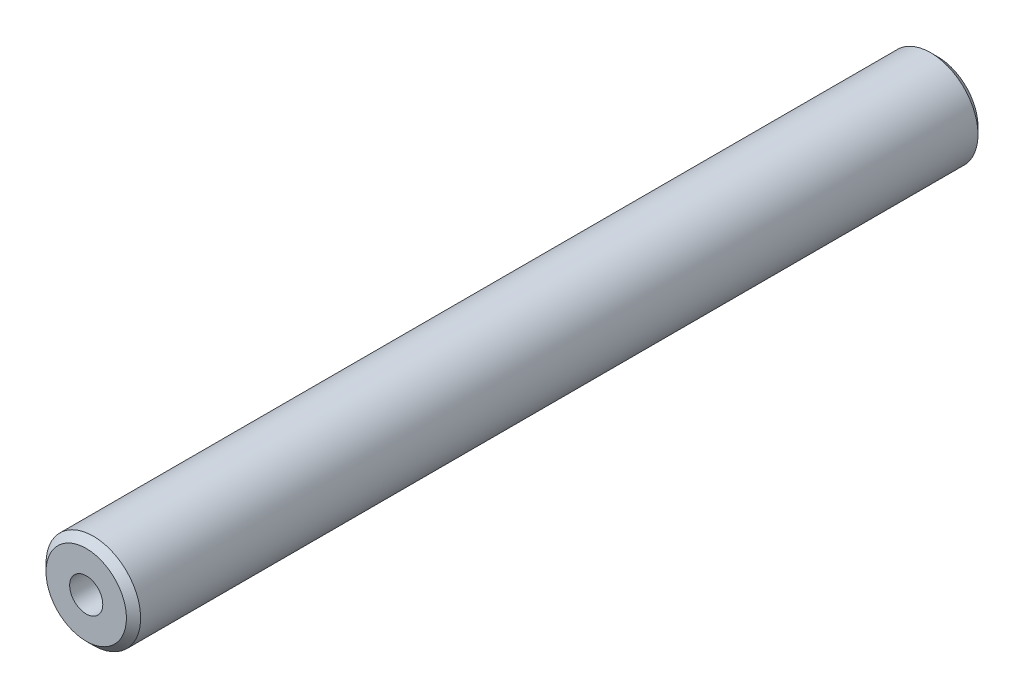
ISO-10303-21;
HEADER;
FILE_DESCRIPTION(('STEP AP214'),'2;1');
FILE_NAME('part.step','',(''),(''),'','','');
FILE_SCHEMA(('AUTOMOTIVE_DESIGN { 1 0 10303 214 1 1 1 1 }'));
ENDSEC;
DATA;
#1=APPLICATION_CONTEXT('core data for automotive mechanical design processes');
#2=APPLICATION_PROTOCOL_DEFINITION('international standard','automotive_design',2000,#1);
#3=PRODUCT_CONTEXT('',#1,'mechanical');
#4=PRODUCT('Part','Part','',(#3));
#5=PRODUCT_RELATED_PRODUCT_CATEGORY('part','',(#4));
#6=PRODUCT_DEFINITION_FORMATION('','',#4);
#7=PRODUCT_DEFINITION_CONTEXT('part definition',#1,'design');
#8=PRODUCT_DEFINITION('design','',#6,#7);
#9=PRODUCT_DEFINITION_SHAPE('','',#8);
#10=(LENGTH_UNIT() NAMED_UNIT(*) SI_UNIT(.MILLI.,.METRE.));
#11=(NAMED_UNIT(*) PLANE_ANGLE_UNIT() SI_UNIT($,.RADIAN.));
#12=(NAMED_UNIT(*) SI_UNIT($,.STERADIAN.) SOLID_ANGLE_UNIT());
#13=UNCERTAINTY_MEASURE_WITH_UNIT(LENGTH_MEASURE(1.E-05),#10,'distance_accuracy_value','');
#14=(GEOMETRIC_REPRESENTATION_CONTEXT(3) GLOBAL_UNCERTAINTY_ASSIGNED_CONTEXT((#13)) GLOBAL_UNIT_ASSIGNED_CONTEXT((#10,
#11,#12)) REPRESENTATION_CONTEXT('',''));
#15=CARTESIAN_POINT('',(0.,0.,0.));
#16=DIRECTION('',(0.,0.,1.));
#17=DIRECTION('',(1.,0.,0.));
#18=AXIS2_PLACEMENT_3D('',#15,#16,#17);
#19=CARTESIAN_POINT('',(0.,0.,180.));
#20=DIRECTION('',(0.,0.,-1.));
#21=DIRECTION('',(-1.,0.,0.));
#22=AXIS2_PLACEMENT_3D('',#19,#20,#21);
#23=CYLINDRICAL_SURFACE('',#22,10.);
#24=CARTESIAN_POINT('',(0.,0.,1.50000000000017));
#25=DIRECTION('',(0.,0.,1.));
#26=DIRECTION('',(1.,0.,0.));
#27=AXIS2_PLACEMENT_3D('',#24,#25,#26);
#28=CIRCLE('',#27,10.);
#29=CARTESIAN_POINT('',(-10.,0.,1.50000000000014));
#30=VERTEX_POINT('',#29);
#31=EDGE_CURVE('E47',#30,#30,#28,.T.);
#32=CARTESIAN_POINT('',(0.,0.,178.5));
#33=DIRECTION('',(0.,0.,1.));
#34=DIRECTION('',(1.,0.,0.));
#35=AXIS2_PLACEMENT_3D('',#32,#33,#34);
#36=CIRCLE('',#35,10.);
#37=CARTESIAN_POINT('',(-10.,0.,178.5));
#38=VERTEX_POINT('',#37);
#39=EDGE_CURVE('E51',#38,#38,#36,.F.);
#40=CARTESIAN_POINT('',(-10.,0.,1.50000000000014));
#41=CARTESIAN_POINT('',(-10.,0.,3.34375000000014));
#42=CARTESIAN_POINT('',(-10.,0.,5.18750000000013));
#43=CARTESIAN_POINT('',(-10.,0.,8.87500000000013));
#44=CARTESIAN_POINT('',(-10.,0.,10.7187500000001));
#45=CARTESIAN_POINT('',(-10.,0.,14.4062500000001));
#46=CARTESIAN_POINT('',(-10.,0.,16.2500000000001));
#47=CARTESIAN_POINT('',(-10.,0.,19.9375000000001));
#48=CARTESIAN_POINT('',(-10.,0.,21.7812500000001));
#49=CARTESIAN_POINT('',(-10.,0.,25.4687500000001));
#50=CARTESIAN_POINT('',(-10.,0.,27.3125000000001));
#51=CARTESIAN_POINT('',(-10.,0.,31.0000000000001));
#52=CARTESIAN_POINT('',(-10.,0.,32.8437500000001));
#53=CARTESIAN_POINT('',(-10.,0.,36.5312500000001));
#54=CARTESIAN_POINT('',(-10.,0.,38.3750000000001));
#55=CARTESIAN_POINT('',(-10.,0.,42.0625000000001));
#56=CARTESIAN_POINT('',(-10.,0.,43.9062500000001));
#57=CARTESIAN_POINT('',(-10.,0.,47.5937500000001));
#58=CARTESIAN_POINT('',(-10.,0.,49.4375000000001));
#59=CARTESIAN_POINT('',(-10.,0.,53.1250000000001));
#60=CARTESIAN_POINT('',(-10.,0.,54.9687500000001));
#61=CARTESIAN_POINT('',(-10.,0.,58.6562500000001));
#62=CARTESIAN_POINT('',(-10.,0.,60.5000000000001));
#63=CARTESIAN_POINT('',(-10.,0.,64.1875000000001));
#64=CARTESIAN_POINT('',(-10.,0.,66.0312500000001));
#65=CARTESIAN_POINT('',(-10.,0.,69.7187500000001));
#66=CARTESIAN_POINT('',(-10.,0.,71.5625000000001));
#67=CARTESIAN_POINT('',(-10.,0.,75.2500000000001));
#68=CARTESIAN_POINT('',(-10.,0.,77.0937500000001));
#69=CARTESIAN_POINT('',(-10.,0.,80.7812500000001));
#70=CARTESIAN_POINT('',(-10.,0.,82.6250000000001));
#71=CARTESIAN_POINT('',(-10.,0.,86.3125000000001));
#72=CARTESIAN_POINT('',(-10.,0.,88.1562500000001));
#73=CARTESIAN_POINT('',(-10.,0.,91.8437500000001));
#74=CARTESIAN_POINT('',(-10.,0.,93.6875000000001));
#75=CARTESIAN_POINT('',(-10.,0.,97.3750000000001));
#76=CARTESIAN_POINT('',(-10.,0.,99.2187500000001));
#77=CARTESIAN_POINT('',(-10.,0.,102.90625));
#78=CARTESIAN_POINT('',(-10.,0.,104.75));
#79=CARTESIAN_POINT('',(-10.,0.,108.4375));
#80=CARTESIAN_POINT('',(-10.,0.,110.28125));
#81=CARTESIAN_POINT('',(-10.,0.,113.96875));
#82=CARTESIAN_POINT('',(-10.,0.,115.8125));
#83=CARTESIAN_POINT('',(-10.,0.,119.5));
#84=CARTESIAN_POINT('',(-10.,0.,121.34375));
#85=CARTESIAN_POINT('',(-10.,0.,125.03125));
#86=CARTESIAN_POINT('',(-10.,0.,126.875));
#87=CARTESIAN_POINT('',(-10.,0.,130.5625));
#88=CARTESIAN_POINT('',(-10.,0.,132.40625));
#89=CARTESIAN_POINT('',(-10.,0.,136.09375));
#90=CARTESIAN_POINT('',(-10.,0.,137.9375));
#91=CARTESIAN_POINT('',(-10.,0.,141.625));
#92=CARTESIAN_POINT('',(-10.,0.,143.46875));
#93=CARTESIAN_POINT('',(-10.,0.,147.15625));
#94=CARTESIAN_POINT('',(-10.,0.,149.));
#95=CARTESIAN_POINT('',(-10.,0.,152.6875));
#96=CARTESIAN_POINT('',(-10.,0.,154.53125));
#97=CARTESIAN_POINT('',(-10.,0.,158.21875));
#98=CARTESIAN_POINT('',(-10.,0.,160.0625));
#99=CARTESIAN_POINT('',(-10.,0.,163.75));
#100=CARTESIAN_POINT('',(-10.,0.,165.59375));
#101=CARTESIAN_POINT('',(-10.,0.,169.28125));
#102=CARTESIAN_POINT('',(-10.,0.,171.125));
#103=CARTESIAN_POINT('',(-10.,0.,174.8125));
#104=CARTESIAN_POINT('',(-10.,0.,176.65625));
#105=CARTESIAN_POINT('',(-10.,0.,178.5));
#106=B_SPLINE_CURVE_WITH_KNOTS('',3,(#40,#41,#42,#43,#44,#45,#46,#47,#48,#49,#50,#51,#52,#53,
#54,#55,#56,#57,#58,#59,#60,#61,#62,#63,#64,#65,#66,#67,#68,#69,#70,#71,#72,#73,#74,#75,#76,#77,
#78,#79,#80,#81,#82,#83,#84,#85,#86,#87,#88,#89,#90,#91,#92,#93,#94,#95,#96,#97,#98,#99,#100,
#101,#102,#103,#104,#105),.UNSPECIFIED.,.F.,.F.,(4,2,2,2,2,2,2,2,2,2,2,2,2,2,2,2,2,2,2,2,2,2,2,
2,2,2,2,2,2,2,2,2,4),(0.,5.53124999999999,11.0625,16.59375,22.125,27.65625,33.1875,38.71875,
44.25,49.78125,55.3125,60.84375,66.375,71.90625,77.4375,82.96875,88.5,94.03125,99.5625,
105.09375,110.625,116.15625,121.6875,127.21875,132.75,138.28125,143.8125,149.34375,154.875,
160.40625,165.9375,171.46875,177.),.UNSPECIFIED.);
#107=EDGE_CURVE('BSEAM36',#30,#38,#106,.T.);
#108=ORIENTED_EDGE('',*,*,#31,.T.);
#109=ORIENTED_EDGE('',*,*,#39,.T.);
#110=ORIENTED_EDGE('',*,*,#107,.T.);
#111=ORIENTED_EDGE('',*,*,#107,.F.);
#112=EDGE_LOOP('',(#108,#110,#109,#111));
#113=FACE_BOUND('',#112,.T.);
#114=ADVANCED_FACE('F36',(#113),#23,.T.);
#115=CARTESIAN_POINT('',(0.,0.,180.));
#116=DIRECTION('',(0.,0.,1.));
#117=DIRECTION('',(1.,0.,0.));
#118=AXIS2_PLACEMENT_3D('',#115,#116,#117);
#119=PLANE('',#118);
#120=CARTESIAN_POINT('',(0.,0.,180.));
#121=DIRECTION('',(0.,0.,1.));
#122=DIRECTION('',(1.,0.,0.));
#123=AXIS2_PLACEMENT_3D('',#120,#121,#122);
#124=CIRCLE('',#123,3.49999999999999);
#125=CARTESIAN_POINT('',(3.49999999999999,0.,180.));
#126=VERTEX_POINT('',#125);
#127=EDGE_CURVE('E59',#126,#126,#124,.T.);
#128=ORIENTED_EDGE('',*,*,#127,.F.);
#129=EDGE_LOOP('',(#128));
#130=FACE_BOUND('',#129,.T.);
#131=CARTESIAN_POINT('',(0.,0.,180.));
#132=DIRECTION('',(0.,0.,1.));
#133=DIRECTION('',(1.,0.,0.));
#134=AXIS2_PLACEMENT_3D('',#131,#132,#133);
#135=CIRCLE('',#134,8.50000000000009);
#136=CARTESIAN_POINT('',(8.50000000000009,0.,180.));
#137=VERTEX_POINT('',#136);
#138=EDGE_CURVE('E10',#137,#137,#135,.T.);
#139=ORIENTED_EDGE('',*,*,#138,.T.);
#140=EDGE_LOOP('',(#139));
#141=FACE_BOUND('',#140,.T.);
#142=ADVANCED_FACE('F65',(#130,#141),#119,.T.);
#143=CARTESIAN_POINT('',(0.,0.,0.));
#144=DIRECTION('',(0.,0.,1.));
#145=DIRECTION('',(1.,0.,0.));
#146=AXIS2_PLACEMENT_3D('',#143,#144,#145);
#147=PLANE('',#146);
#148=CARTESIAN_POINT('',(0.,0.,0.));
#149=DIRECTION('',(0.,0.,1.));
#150=DIRECTION('',(1.,0.,0.));
#151=AXIS2_PLACEMENT_3D('',#148,#149,#150);
#152=CIRCLE('',#151,3.49999999999998);
#153=CARTESIAN_POINT('',(3.49999999999998,0.,0.));
#154=VERTEX_POINT('',#153);
#155=EDGE_CURVE('E56',#154,#154,#152,.T.);
#156=ORIENTED_EDGE('',*,*,#155,.T.);
#157=EDGE_LOOP('',(#156));
#158=FACE_BOUND('',#157,.T.);
#159=CARTESIAN_POINT('',(0.,0.,0.));
#160=DIRECTION('',(0.,0.,1.));
#161=DIRECTION('',(1.,0.,0.));
#162=AXIS2_PLACEMENT_3D('',#159,#160,#161);
#163=CIRCLE('',#162,8.49999999999983);
#164=CARTESIAN_POINT('',(8.49999999999983,0.,0.));
#165=VERTEX_POINT('',#164);
#166=EDGE_CURVE('E43',#165,#165,#163,.F.);
#167=ORIENTED_EDGE('',*,*,#166,.T.);
#168=EDGE_LOOP('',(#167));
#169=FACE_BOUND('',#168,.T.);
#170=ADVANCED_FACE('F67',(#158,#169),#147,.F.);
#171=CARTESIAN_POINT('',(0.,0.,1.50000000000017));
#172=DIRECTION('',(0.,0.,1.));
#173=DIRECTION('',(1.,0.,0.));
#174=AXIS2_PLACEMENT_3D('',#171,#172,#173);
#175=CONICAL_SURFACE('',#174,10.,0.785398163397451);
#176=ORIENTED_EDGE('',*,*,#166,.F.);
#177=EDGE_LOOP('',(#176));
#178=FACE_BOUND('',#177,.T.);
#179=ORIENTED_EDGE('',*,*,#31,.F.);
#180=EDGE_LOOP('',(#179));
#181=FACE_BOUND('',#180,.T.);
#182=ADVANCED_FACE('F73',(#178,#181),#175,.T.);
#183=CARTESIAN_POINT('',(0.,0.,180.));
#184=DIRECTION('',(0.,0.,-1.));
#185=DIRECTION('',(-1.,0.,0.));
#186=AXIS2_PLACEMENT_3D('',#183,#184,#185);
#187=CONICAL_SURFACE('',#186,8.50000000000009,0.785398163397455);
#188=ORIENTED_EDGE('',*,*,#39,.F.);
#189=EDGE_LOOP('',(#188));
#190=FACE_BOUND('',#189,.T.);
#191=ORIENTED_EDGE('',*,*,#138,.F.);
#192=EDGE_LOOP('',(#191));
#193=FACE_BOUND('',#192,.T.);
#194=ADVANCED_FACE('F38',(#190,#193),#187,.T.);
#195=CARTESIAN_POINT('',(0.,0.,180.));
#196=DIRECTION('',(0.,0.,1.));
#197=DIRECTION('',(1.,0.,0.));
#198=AXIS2_PLACEMENT_3D('',#195,#196,#197);
#199=CYLINDRICAL_SURFACE('',#198,3.49999999999998);
#200=ORIENTED_EDGE('',*,*,#155,.F.);
#201=EDGE_LOOP('',(#200));
#202=FACE_BOUND('',#201,.T.);
#203=ORIENTED_EDGE('',*,*,#127,.T.);
#204=EDGE_LOOP('',(#203));
#205=FACE_BOUND('',#204,.T.);
#206=ADVANCED_FACE('F63',(#202,#205),#199,.F.);
#207=CLOSED_SHELL('',(#114,#142,#170,#182,#194,#206));
#208=MANIFOLD_SOLID_BREP('B2',#207);
#209=ADVANCED_BREP_SHAPE_REPRESENTATION('',(#18,#208),#14);
#210=SHAPE_DEFINITION_REPRESENTATION(#9,#209);
ENDSEC;
END-ISO-10303-21;
